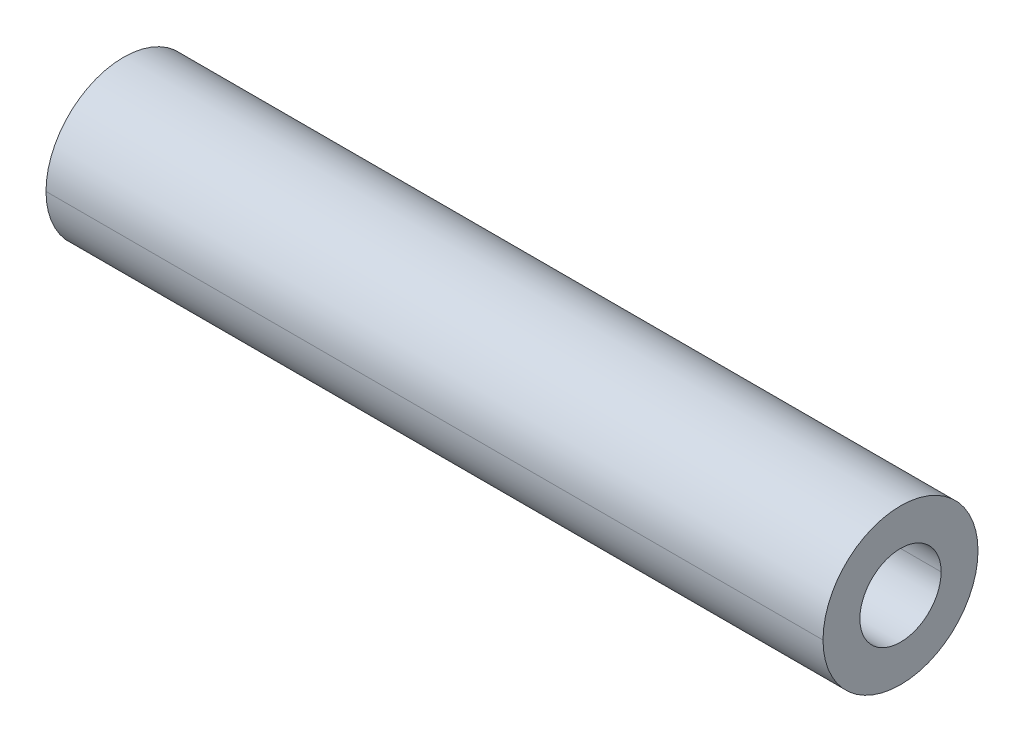
ISO-10303-21;
HEADER;
FILE_DESCRIPTION(('STEP AP214'),'2;1');
FILE_NAME('part.step','',(''),(''),'','','');
FILE_SCHEMA(('AUTOMOTIVE_DESIGN { 1 0 10303 214 1 1 1 1 }'));
ENDSEC;
DATA;
#1=APPLICATION_CONTEXT('core data for automotive mechanical design processes');
#2=APPLICATION_PROTOCOL_DEFINITION('international standard','automotive_design',2000,#1);
#3=PRODUCT_CONTEXT('',#1,'mechanical');
#4=PRODUCT('Part','Part','',(#3));
#5=PRODUCT_RELATED_PRODUCT_CATEGORY('part','',(#4));
#6=PRODUCT_DEFINITION_FORMATION('','',#4);
#7=PRODUCT_DEFINITION_CONTEXT('part definition',#1,'design');
#8=PRODUCT_DEFINITION('design','',#6,#7);
#9=PRODUCT_DEFINITION_SHAPE('','',#8);
#10=(LENGTH_UNIT() NAMED_UNIT(*) SI_UNIT(.MILLI.,.METRE.));
#11=(NAMED_UNIT(*) PLANE_ANGLE_UNIT() SI_UNIT($,.RADIAN.));
#12=(NAMED_UNIT(*) SI_UNIT($,.STERADIAN.) SOLID_ANGLE_UNIT());
#13=UNCERTAINTY_MEASURE_WITH_UNIT(LENGTH_MEASURE(1.E-05),#10,'distance_accuracy_value','');
#14=(GEOMETRIC_REPRESENTATION_CONTEXT(3) GLOBAL_UNCERTAINTY_ASSIGNED_CONTEXT((#13)) GLOBAL_UNIT_ASSIGNED_CONTEXT((#10,
#11,#12)) REPRESENTATION_CONTEXT('',''));
#15=CARTESIAN_POINT('',(0.,0.,0.));
#16=DIRECTION('',(0.,0.,1.));
#17=DIRECTION('',(1.,0.,0.));
#18=AXIS2_PLACEMENT_3D('',#15,#16,#17);
#19=CARTESIAN_POINT('',(23.8125,0.,0.));
#20=DIRECTION('',(-1.,0.,0.));
#21=DIRECTION('',(0.,0.,1.));
#22=AXIS2_PLACEMENT_3D('',#19,#20,#21);
#23=CYLINDRICAL_SURFACE('',#22,2.4892);
#24=DIRECTION('',(-1.,0.,0.));
#25=VECTOR('',#24,1.);
#26=CARTESIAN_POINT('',(23.8125,0.,-2.4892));
#27=LINE('',#26,#25);
#28=CARTESIAN_POINT('',(23.8125,0.,-2.4892));
#29=VERTEX_POINT('',#28);
#30=CARTESIAN_POINT('',(-23.8125,0.,-2.4892));
#31=VERTEX_POINT('',#30);
#32=EDGE_CURVE('E100',#29,#31,#27,.T.);
#33=ORIENTED_EDGE('',*,*,#32,.F.);
#34=CARTESIAN_POINT('',(23.8125,0.,0.));
#35=DIRECTION('',(1.,0.,0.));
#36=DIRECTION('',(0.,0.,-1.));
#37=AXIS2_PLACEMENT_3D('',#34,#35,#36);
#38=CIRCLE('',#37,2.4892);
#39=CARTESIAN_POINT('',(23.8125,0.,2.4892));
#40=VERTEX_POINT('',#39);
#41=EDGE_CURVE('E76',#29,#40,#38,.T.);
#42=ORIENTED_EDGE('',*,*,#41,.T.);
#43=DIRECTION('',(-1.,0.,0.));
#44=VECTOR('',#43,1.);
#45=CARTESIAN_POINT('',(23.8125,0.,2.4892));
#46=LINE('',#45,#44);
#47=CARTESIAN_POINT('',(-23.8125,0.,2.4892));
#48=VERTEX_POINT('',#47);
#49=EDGE_CURVE('E85',#40,#48,#46,.T.);
#50=ORIENTED_EDGE('',*,*,#49,.T.);
#51=CARTESIAN_POINT('',(-23.8125,0.,0.));
#52=DIRECTION('',(1.,0.,0.));
#53=DIRECTION('',(0.,0.,-1.));
#54=AXIS2_PLACEMENT_3D('',#51,#52,#53);
#55=CIRCLE('',#54,2.4892);
#56=EDGE_CURVE('E11',#31,#48,#55,.T.);
#57=ORIENTED_EDGE('',*,*,#56,.F.);
#58=EDGE_LOOP('',(#33,#42,#50,#57));
#59=FACE_BOUND('',#58,.T.);
#60=ADVANCED_FACE('F16',(#59),#23,.F.);
#61=CARTESIAN_POINT('',(23.8125,0.,0.));
#62=DIRECTION('',(-1.,0.,0.));
#63=DIRECTION('',(0.,0.,1.));
#64=AXIS2_PLACEMENT_3D('',#61,#62,#63);
#65=CYLINDRICAL_SURFACE('',#64,4.7498);
#66=DIRECTION('',(-1.,0.,0.));
#67=VECTOR('',#66,1.);
#68=CARTESIAN_POINT('',(23.8125,0.,-4.7498));
#69=LINE('',#68,#67);
#70=CARTESIAN_POINT('',(23.8125,0.,-4.7498));
#71=VERTEX_POINT('',#70);
#72=CARTESIAN_POINT('',(-23.8125,0.,-4.7498));
#73=VERTEX_POINT('',#72);
#74=EDGE_CURVE('E71',#71,#73,#69,.T.);
#75=ORIENTED_EDGE('',*,*,#74,.F.);
#76=CARTESIAN_POINT('',(23.8125,0.,0.));
#77=DIRECTION('',(1.,0.,0.));
#78=DIRECTION('',(0.,0.,-1.));
#79=AXIS2_PLACEMENT_3D('',#76,#77,#78);
#80=CIRCLE('',#79,4.7498);
#81=CARTESIAN_POINT('',(23.8125,0.,4.7498));
#82=VERTEX_POINT('',#81);
#83=EDGE_CURVE('E65',#82,#71,#80,.T.);
#84=ORIENTED_EDGE('',*,*,#83,.F.);
#85=DIRECTION('',(-1.,0.,0.));
#86=VECTOR('',#85,1.);
#87=CARTESIAN_POINT('',(23.8125,0.,4.7498));
#88=LINE('',#87,#86);
#89=CARTESIAN_POINT('',(-23.8125,0.,4.7498));
#90=VERTEX_POINT('',#89);
#91=EDGE_CURVE('E68',#82,#90,#88,.T.);
#92=ORIENTED_EDGE('',*,*,#91,.T.);
#93=CARTESIAN_POINT('',(-23.8125,0.,0.));
#94=DIRECTION('',(1.,0.,0.));
#95=DIRECTION('',(0.,0.,-1.));
#96=AXIS2_PLACEMENT_3D('',#93,#94,#95);
#97=CIRCLE('',#96,4.7498);
#98=EDGE_CURVE('E20',#90,#73,#97,.T.);
#99=ORIENTED_EDGE('',*,*,#98,.T.);
#100=EDGE_LOOP('',(#75,#84,#92,#99));
#101=FACE_BOUND('',#100,.T.);
#102=ADVANCED_FACE('F67',(#101),#65,.T.);
#103=CARTESIAN_POINT('',(-23.8125,0.,0.));
#104=DIRECTION('',(1.,0.,0.));
#105=DIRECTION('',(0.,1.,0.));
#106=AXIS2_PLACEMENT_3D('',#103,#104,#105);
#107=PLANE('',#106);
#108=CARTESIAN_POINT('',(-23.8125,0.,0.));
#109=DIRECTION('',(1.,0.,0.));
#110=DIRECTION('',(0.,0.,-1.));
#111=AXIS2_PLACEMENT_3D('',#108,#109,#110);
#112=CIRCLE('',#111,2.4892);
#113=EDGE_CURVE('E93',#48,#31,#112,.T.);
#114=ORIENTED_EDGE('',*,*,#113,.T.);
#115=ORIENTED_EDGE('',*,*,#56,.T.);
#116=EDGE_LOOP('',(#114,#115));
#117=FACE_BOUND('',#116,.T.);
#118=ORIENTED_EDGE('',*,*,#98,.F.);
#119=CARTESIAN_POINT('',(-23.8125,0.,0.));
#120=DIRECTION('',(1.,0.,0.));
#121=DIRECTION('',(0.,0.,-1.));
#122=AXIS2_PLACEMENT_3D('',#119,#120,#121);
#123=CIRCLE('',#122,4.7498);
#124=EDGE_CURVE('E81',#73,#90,#123,.T.);
#125=ORIENTED_EDGE('',*,*,#124,.F.);
#126=EDGE_LOOP('',(#118,#125));
#127=FACE_BOUND('',#126,.T.);
#128=ADVANCED_FACE('F125',(#117,#127),#107,.F.);
#129=CARTESIAN_POINT('',(23.8125,0.,0.));
#130=DIRECTION('',(1.,0.,0.));
#131=DIRECTION('',(0.,1.,0.));
#132=AXIS2_PLACEMENT_3D('',#129,#130,#131);
#133=PLANE('',#132);
#134=CARTESIAN_POINT('',(23.8125,0.,0.));
#135=DIRECTION('',(1.,0.,0.));
#136=DIRECTION('',(0.,0.,-1.));
#137=AXIS2_PLACEMENT_3D('',#134,#135,#136);
#138=CIRCLE('',#137,2.4892);
#139=EDGE_CURVE('E97',#40,#29,#138,.T.);
#140=ORIENTED_EDGE('',*,*,#139,.F.);
#141=ORIENTED_EDGE('',*,*,#41,.F.);
#142=EDGE_LOOP('',(#140,#141));
#143=FACE_BOUND('',#142,.T.);
#144=ORIENTED_EDGE('',*,*,#83,.T.);
#145=CARTESIAN_POINT('',(23.8125,0.,0.));
#146=DIRECTION('',(1.,0.,0.));
#147=DIRECTION('',(0.,0.,-1.));
#148=AXIS2_PLACEMENT_3D('',#145,#146,#147);
#149=CIRCLE('',#148,4.7498);
#150=EDGE_CURVE('E80',#71,#82,#149,.T.);
#151=ORIENTED_EDGE('',*,*,#150,.T.);
#152=EDGE_LOOP('',(#144,#151));
#153=FACE_BOUND('',#152,.T.);
#154=ADVANCED_FACE('F18',(#143,#153),#133,.T.);
#155=CARTESIAN_POINT('',(23.8125,0.,0.));
#156=DIRECTION('',(-1.,0.,0.));
#157=DIRECTION('',(0.,0.,1.));
#158=AXIS2_PLACEMENT_3D('',#155,#156,#157);
#159=CYLINDRICAL_SURFACE('',#158,4.7498);
#160=ORIENTED_EDGE('',*,*,#150,.F.);
#161=ORIENTED_EDGE('',*,*,#74,.T.);
#162=ORIENTED_EDGE('',*,*,#124,.T.);
#163=ORIENTED_EDGE('',*,*,#91,.F.);
#164=EDGE_LOOP('',(#160,#161,#162,#163));
#165=FACE_BOUND('',#164,.T.);
#166=ADVANCED_FACE('F79',(#165),#159,.T.);
#167=CARTESIAN_POINT('',(23.8125,0.,0.));
#168=DIRECTION('',(-1.,0.,0.));
#169=DIRECTION('',(0.,0.,1.));
#170=AXIS2_PLACEMENT_3D('',#167,#168,#169);
#171=CYLINDRICAL_SURFACE('',#170,2.4892);
#172=ORIENTED_EDGE('',*,*,#139,.T.);
#173=ORIENTED_EDGE('',*,*,#32,.T.);
#174=ORIENTED_EDGE('',*,*,#113,.F.);
#175=ORIENTED_EDGE('',*,*,#49,.F.);
#176=EDGE_LOOP('',(#172,#173,#174,#175));
#177=FACE_BOUND('',#176,.T.);
#178=ADVANCED_FACE('F140',(#177),#171,.F.);
#179=CLOSED_SHELL('',(#60,#102,#128,#154,#166,#178));
#180=MANIFOLD_SOLID_BREP('B1',#179);
#181=ADVANCED_BREP_SHAPE_REPRESENTATION('',(#18,#180),#14);
#182=SHAPE_DEFINITION_REPRESENTATION(#9,#181);
ENDSEC;
END-ISO-10303-21;
